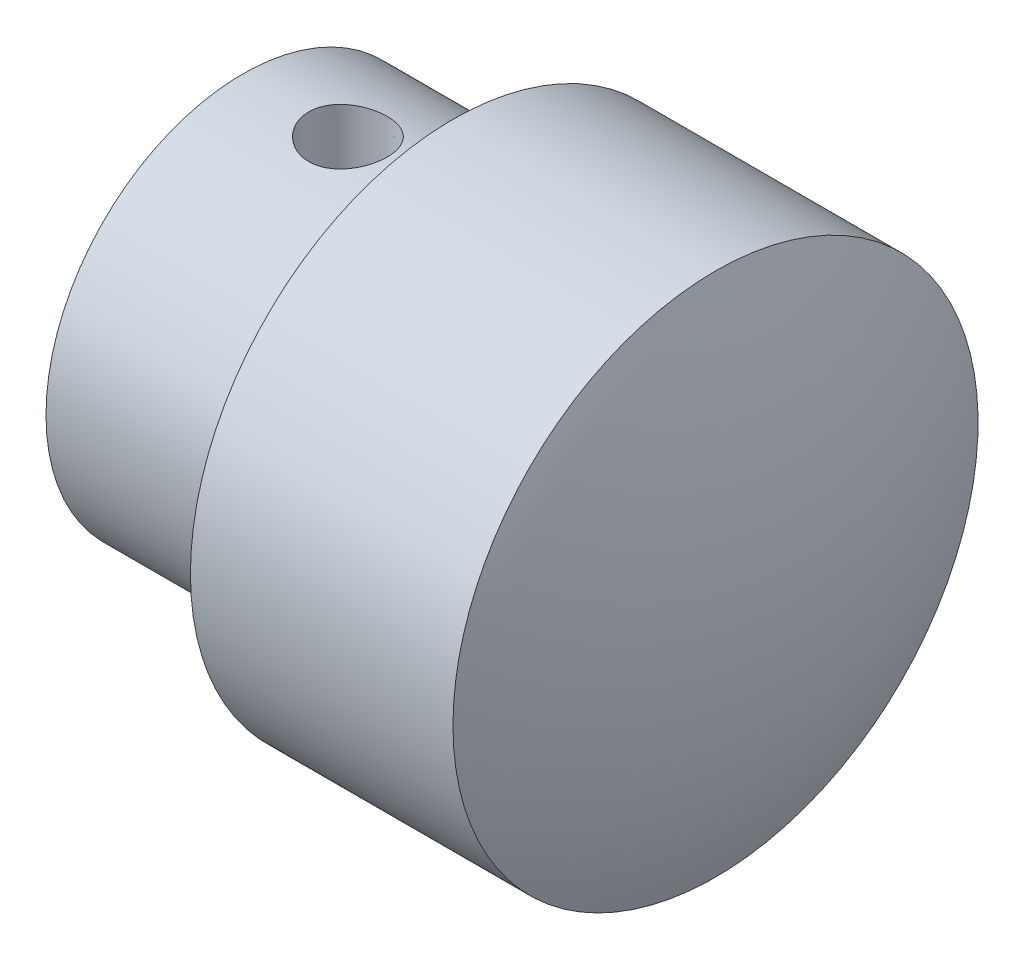
ISO-10303-21;
HEADER;
FILE_DESCRIPTION(('STEP AP214'),'2;1');
FILE_NAME('part.step','',(''),(''),'','','');
FILE_SCHEMA(('AUTOMOTIVE_DESIGN { 1 0 10303 214 1 1 1 1 }'));
ENDSEC;
DATA;
#1=APPLICATION_CONTEXT('core data for automotive mechanical design processes');
#2=APPLICATION_PROTOCOL_DEFINITION('international standard','automotive_design',2000,#1);
#3=PRODUCT_CONTEXT('',#1,'mechanical');
#4=PRODUCT('Part','Part','',(#3));
#5=PRODUCT_RELATED_PRODUCT_CATEGORY('part','',(#4));
#6=PRODUCT_DEFINITION_FORMATION('','',#4);
#7=PRODUCT_DEFINITION_CONTEXT('part definition',#1,'design');
#8=PRODUCT_DEFINITION('design','',#6,#7);
#9=PRODUCT_DEFINITION_SHAPE('','',#8);
#10=(LENGTH_UNIT() NAMED_UNIT(*) SI_UNIT(.MILLI.,.METRE.));
#11=(NAMED_UNIT(*) PLANE_ANGLE_UNIT() SI_UNIT($,.RADIAN.));
#12=(NAMED_UNIT(*) SI_UNIT($,.STERADIAN.) SOLID_ANGLE_UNIT());
#13=UNCERTAINTY_MEASURE_WITH_UNIT(LENGTH_MEASURE(1.E-05),#10,'distance_accuracy_value','');
#14=(GEOMETRIC_REPRESENTATION_CONTEXT(3) GLOBAL_UNCERTAINTY_ASSIGNED_CONTEXT((#13)) GLOBAL_UNIT_ASSIGNED_CONTEXT((#10,
#11,#12)) REPRESENTATION_CONTEXT('',''));
#15=CARTESIAN_POINT('',(0.,0.,0.));
#16=DIRECTION('',(0.,0.,1.));
#17=DIRECTION('',(1.,0.,0.));
#18=AXIS2_PLACEMENT_3D('',#15,#16,#17);
#19=CARTESIAN_POINT('',(0.,0.,0.));
#20=DIRECTION('',(-1.,0.,0.));
#21=DIRECTION('',(0.,0.,1.));
#22=AXIS2_PLACEMENT_3D('',#19,#20,#21);
#23=CYLINDRICAL_SURFACE('',#22,7.5);
#24=CARTESIAN_POINT('',(0.,0.,0.));
#25=DIRECTION('',(-1.,0.,0.));
#26=DIRECTION('',(0.,0.,1.));
#27=AXIS2_PLACEMENT_3D('',#24,#25,#26);
#28=CIRCLE('',#27,7.49999999999999);
#29=CARTESIAN_POINT('',(0.,0.,7.49999999999999));
#30=VERTEX_POINT('',#29);
#31=EDGE_CURVE('E11',#30,#30,#28,.T.);
#32=ORIENTED_EDGE('',*,*,#31,.F.);
#33=EDGE_LOOP('',(#32));
#34=FACE_BOUND('',#33,.T.);
#35=CARTESIAN_POINT('',(8.,0.,0.));
#36=DIRECTION('',(-1.,0.,0.));
#37=DIRECTION('',(0.,0.,1.));
#38=AXIS2_PLACEMENT_3D('',#35,#36,#37);
#39=CIRCLE('',#38,7.5);
#40=CARTESIAN_POINT('',(8.,0.,7.5));
#41=VERTEX_POINT('',#40);
#42=EDGE_CURVE('E59',#41,#41,#39,.T.);
#43=ORIENTED_EDGE('',*,*,#42,.T.);
#44=EDGE_LOOP('',(#43));
#45=FACE_BOUND('',#44,.T.);
#46=CARTESIAN_POINT('',(2.97615065401685,7.42093844691968,-1.08612732542257));
#47=CARTESIAN_POINT('',(2.91522724591919,7.42933419585588,-1.02875917320754));
#48=CARTESIAN_POINT('',(2.85911370874383,7.43780352092569,-0.966236493464316));
#49=CARTESIAN_POINT('',(2.7580842460814,7.45394905366219,-0.832570128404476));
#50=CARTESIAN_POINT('',(2.71317695100907,7.4616246473942,-0.761419860882538));
#51=CARTESIAN_POINT('',(2.63587515097579,7.47532757332012,-0.612428147921648));
#52=CARTESIAN_POINT('',(2.60348496098401,7.481354336911,-0.53458440635436));
#53=CARTESIAN_POINT('',(2.55224637023567,7.49107627205063,-0.37443796083214));
#54=CARTESIAN_POINT('',(2.53339436926293,7.49477206344392,-0.292136448599569));
#55=CARTESIAN_POINT('',(2.50997578782903,7.49938471505593,-0.126508551241872));
#56=CARTESIAN_POINT('',(2.50523211115868,7.50033602112167,-0.0432081665425652));
#57=CARTESIAN_POINT('',(2.5096805906007,7.49945173465987,0.123003414211219));
#58=CARTESIAN_POINT('',(2.51887235131164,7.49761622120503,0.205914621241193));
#59=CARTESIAN_POINT('',(2.55073377020251,7.4913950904734,0.368141519096682));
#60=CARTESIAN_POINT('',(2.57326876218644,7.48703496238873,0.447484727147392));
#61=CARTESIAN_POINT('',(2.6310192630518,7.47625776783849,0.601262464158107));
#62=CARTESIAN_POINT('',(2.6662356201932,7.46984056377769,0.675696664359079));
#63=CARTESIAN_POINT('',(2.74881056768671,7.45555373059613,0.81849407662295));
#64=CARTESIAN_POINT('',(2.79630434051209,7.44766822375624,0.88677748815425));
#65=CARTESIAN_POINT('',(2.90191625503024,7.43134952875286,1.01449333004704));
#66=CARTESIAN_POINT('',(2.96003555570116,7.42291628090934,1.07392479359887));
#67=CARTESIAN_POINT('',(3.08635746819034,7.4062862899119,1.18323096408435));
#68=CARTESIAN_POINT('',(3.15470670886635,7.39809550048994,1.23293730535804));
#69=CARTESIAN_POINT('',(3.29891020726078,7.3830275827894,1.32017851698108));
#70=CARTESIAN_POINT('',(3.37476426966443,7.37615042033701,1.35771370397893));
#71=CARTESIAN_POINT('',(3.53158457609144,7.36453281304644,1.41938150136861));
#72=CARTESIAN_POINT('',(3.61253165577032,7.35978484730975,1.44356135767189));
#73=CARTESIAN_POINT('',(3.77744635859976,7.35295599944563,1.47795482333213));
#74=CARTESIAN_POINT('',(3.86141358926746,7.3508747720412,1.48817024075182));
#75=CARTESIAN_POINT('',(4.02840277288348,7.34964116935119,1.49425009977339));
#76=CARTESIAN_POINT('',(4.11141536177421,7.35043790337176,1.49036389335648));
#77=CARTESIAN_POINT('',(4.27557960729545,7.35475292683973,1.46892025419259));
#78=CARTESIAN_POINT('',(4.35673129129481,7.3582711762346,1.45136302264207));
#79=CARTESIAN_POINT('',(4.514610166327,7.36760425417636,1.40321100089764));
#80=CARTESIAN_POINT('',(4.59135183573448,7.37341100956784,1.37266201204682));
#81=CARTESIAN_POINT('',(4.73865434456207,7.3866678725096,1.29942919143104));
#82=CARTESIAN_POINT('',(4.80921455507332,7.39411814700278,1.25674412679878));
#83=CARTESIAN_POINT('',(4.94337947522732,7.4099726727846,1.15963651080529));
#84=CARTESIAN_POINT('',(5.00685356445429,7.41839037874386,1.10503566084357));
#85=CARTESIAN_POINT('',(5.12381019671236,7.43514699865154,0.985999341140916));
#86=CARTESIAN_POINT('',(5.17729200099745,7.44348590673106,0.921563144896099));
#87=CARTESIAN_POINT('',(5.27328997087178,7.45924969673335,0.783861107239898));
#88=CARTESIAN_POINT('',(5.31568617685491,7.46666415892899,0.710510324868336));
#89=CARTESIAN_POINT('',(5.38751451237156,7.47963952548557,0.557561509248243));
#90=CARTESIAN_POINT('',(5.41694773690012,7.48520058639539,0.47796400433562));
#91=CARTESIAN_POINT('',(5.46166751556251,7.49378528085991,0.315750911835908));
#92=CARTESIAN_POINT('',(5.47711402297072,7.49683756672341,0.233180976893757));
#93=CARTESIAN_POINT('',(5.49394125072759,7.50016714558136,0.0665683518774799));
#94=CARTESIAN_POINT('',(5.49532346480348,7.50044473326829,-0.0174741808466193));
#95=CARTESIAN_POINT('',(5.48407089236997,7.49821239079189,-0.183239764262011));
#96=CARTESIAN_POINT('',(5.47165659716133,7.49574630838335,-0.264978497434312));
#97=CARTESIAN_POINT('',(5.43355572605268,7.48836783291416,-0.425183368633737));
#98=CARTESIAN_POINT('',(5.40786884560192,7.48345538371964,-0.503649431522007));
#99=CARTESIAN_POINT('',(5.34387709118843,7.47169442085938,-0.655442647988567));
#100=CARTESIAN_POINT('',(5.30552506899513,7.46483868668969,-0.72874933871561));
#101=CARTESIAN_POINT('',(5.21732495312889,7.44993723926267,-0.867953226556022));
#102=CARTESIAN_POINT('',(5.16747553960559,7.44189138942333,-0.933849571701131));
#103=CARTESIAN_POINT('',(5.05665481638438,7.42532543295365,-1.05759849096597));
#104=CARTESIAN_POINT('',(4.99550236128998,7.41679945458319,-1.11528815083435));
#105=CARTESIAN_POINT('',(4.86434270632167,7.40035618998209,-1.21964195696541));
#106=CARTESIAN_POINT('',(4.79433513052719,7.39243892961592,-1.26630563490805));
#107=CARTESIAN_POINT('',(4.64696511413129,7.37807239990575,-1.34750292605347));
#108=CARTESIAN_POINT('',(4.56956523451129,7.37163123309209,-1.38197012748431));
#109=CARTESIAN_POINT('',(4.40991927726535,7.36103082172352,-1.43736823368169));
#110=CARTESIAN_POINT('',(4.32767388336374,7.35687125607415,-1.45830104324547));
#111=CARTESIAN_POINT('',(4.16201677828068,7.35137690196529,-1.48574992383013));
#112=CARTESIAN_POINT('',(4.07864225751667,7.34999980009896,-1.49248201821368));
#113=CARTESIAN_POINT('',(3.91192940208632,7.35010677846984,-1.49195538120147));
#114=CARTESIAN_POINT('',(3.82859107074363,7.35159108153114,-1.48469556022351));
#115=CARTESIAN_POINT('',(3.66531755208976,7.35721164448419,-1.4565834976114));
#116=CARTESIAN_POINT('',(3.58535453592143,7.36131772156346,-1.43588591139124));
#117=CARTESIAN_POINT('',(3.4300876957901,7.37168210487176,-1.38168683092028));
#118=CARTESIAN_POINT('',(3.35478083424037,7.37793899009575,-1.34819378880254));
#119=CARTESIAN_POINT('',(3.22719505297857,7.39031313797362,-1.27836598689928));
#120=CARTESIAN_POINT('',(3.17357123116635,7.39613921155687,-1.24440531592062));
#121=CARTESIAN_POINT('',(3.07109718241153,7.40827562078396,-1.16998932371552));
#122=CARTESIAN_POINT('',(3.02224711995708,7.41458597310109,-1.12953377882378));
#123=CARTESIAN_POINT('',(2.97615065401685,7.42093844691968,-1.08612732542257));
#124=B_SPLINE_CURVE_WITH_KNOTS('',3,(#46,#47,#48,#49,#50,#51,#52,#53,#54,#55,#56,#57,#58,#59,
#60,#61,#62,#63,#64,#65,#66,#67,#68,#69,#70,#71,#72,#73,#74,#75,#76,#77,#78,#79,#80,#81,#82,#83,
#84,#85,#86,#87,#88,#89,#90,#91,#92,#93,#94,#95,#96,#97,#98,#99,#100,#101,#102,#103,#104,#105,
#106,#107,#108,#109,#110,#111,#112,#113,#114,#115,#116,#117,#118,#119,#120,#121,#122,#123),
.UNSPECIFIED.,.T.,.F.,(4,2,2,2,2,2,2,2,2,2,2,2,2,2,2,2,2,2,2,2,2,2,2,2,2,2,2,2,2,2,2,2,2,2,2,2,
2,2,4),(0.,0.252081515947381,0.504356575807323,0.756718523979321,1.00901333655779,
1.25812753816831,1.50723467159227,1.7538695512333,2.0005209314142,2.25001324622722,
2.49953279063766,2.75304994086387,3.00656049498048,3.25916838854258,3.511743572291,
3.75987453155652,4.00800183914809,4.25526155314622,4.5025463944922,4.75382181659721,
5.00511580856114,5.25902601201058,5.51291476331455,5.76386194197726,6.014782468,
6.26174980309121,6.50872280530964,6.7566257722431,7.00455721153216,7.25687452444697,
7.50920255241852,7.76288413733752,8.01653001195424,8.26628870770265,8.51606685351331,
8.76302007225518,9.00981044549054,9.20053626241585,9.39126864881489),.UNSPECIFIED.);
#125=CARTESIAN_POINT('',(2.97615065401685,7.42093844691968,-1.08612732542257));
#126=VERTEX_POINT('',#125);
#127=EDGE_CURVE('E108',#126,#126,#124,.T.);
#128=ORIENTED_EDGE('',*,*,#127,.F.);
#129=EDGE_LOOP('',(#128));
#130=FACE_BOUND('',#129,.T.);
#131=CARTESIAN_POINT('',(3.03665773118595,-7.4293107576259,-1.02729823645528));
#132=CARTESIAN_POINT('',(3.09410278698516,-7.42185457442499,-1.08122153369808));
#133=CARTESIAN_POINT('',(3.15611413118544,-7.41446288827785,-1.13034511803816));
#134=CARTESIAN_POINT('',(3.28759199724185,-7.40063679882848,-1.21759468075537));
#135=CARTESIAN_POINT('',(3.35706423407999,-7.39420313849887,-1.25571214490594));
#136=CARTESIAN_POINT('',(3.5015636904899,-7.38303094592566,-1.31981747397934));
#137=CARTESIAN_POINT('',(3.57659278703572,-7.37829298963103,-1.34580121857376));
#138=CARTESIAN_POINT('',(3.73003729575592,-7.37107267072744,-1.38480542124693));
#139=CARTESIAN_POINT('',(3.80845182302608,-7.36858972238553,-1.39782924571823));
#140=CARTESIAN_POINT('',(3.96544185899129,-7.3661882554668,-1.41042963417831));
#141=CARTESIAN_POINT('',(4.04400408963656,-7.36623925442609,-1.41016604041192));
#142=CARTESIAN_POINT('',(4.19995150518375,-7.36882377129706,-1.39659680128372));
#143=CARTESIAN_POINT('',(4.27733668946113,-7.37135729052588,-1.38329114900225));
#144=CARTESIAN_POINT('',(4.42827401913363,-7.37858950483184,-1.34417463528646));
#145=CARTESIAN_POINT('',(4.50184618143085,-7.38327526513212,-1.318438433359));
#146=CARTESIAN_POINT('',(4.6436468019706,-7.39427802885979,-1.25525903299782));
#147=CARTESIAN_POINT('',(4.71187482234242,-7.40059516577172,-1.2178148765284));
#148=CARTESIAN_POINT('',(4.84205612858868,-7.41425618778502,-1.13169135734835));
#149=CARTESIAN_POINT('',(4.90391208535388,-7.42161280226302,-1.0828669097833));
#150=CARTESIAN_POINT('',(5.01862850046725,-7.43647136584286,-0.975611862252668));
#151=CARTESIAN_POINT('',(5.07148822447486,-7.44397332675336,-0.917180478860985));
#152=CARTESIAN_POINT('',(5.16736409070226,-7.45838816438591,-0.791509780578306));
#153=CARTESIAN_POINT('',(5.21025162708516,-7.46529269283949,-0.724171277491351));
#154=CARTESIAN_POINT('',(5.28409767955282,-7.47763186538167,-0.583118150966646));
#155=CARTESIAN_POINT('',(5.31505681113753,-7.48306658530736,-0.509403856757048));
#156=CARTESIAN_POINT('',(5.36393002978088,-7.4918193358684,-0.35823201345033));
#157=CARTESIAN_POINT('',(5.3819358411742,-7.49515222865436,-0.280805010399186));
#158=CARTESIAN_POINT('',(5.4046921275896,-7.49938549662434,-0.123964561431673));
#159=CARTESIAN_POINT('',(5.40944393056179,-7.5002861155033,-0.0445513153261188));
#160=CARTESIAN_POINT('',(5.40557130745179,-7.49955876984867,0.112776464756872));
#161=CARTESIAN_POINT('',(5.39714023978844,-7.49796735644071,0.190696008919006));
#162=CARTESIAN_POINT('',(5.36752574567137,-7.49250008233031,0.343987044477736));
#163=CARTESIAN_POINT('',(5.34634223952669,-7.48862420735211,0.419358519948146));
#164=CARTESIAN_POINT('',(5.29184456233883,-7.47900872297953,0.565509224018031));
#165=CARTESIAN_POINT('',(5.2585216409348,-7.47326776951889,0.636285096535123));
#166=CARTESIAN_POINT('',(5.18070571903896,-7.4605446920175,0.771282083495594));
#167=CARTESIAN_POINT('',(5.13621164142587,-7.45356244831068,0.835502565028763));
#168=CARTESIAN_POINT('',(5.0365331690706,-7.43900029725952,0.95658444530349));
#169=CARTESIAN_POINT('',(4.98119980731926,-7.43141305319623,1.01332237216176));
#170=CARTESIAN_POINT('',(4.86178558322886,-7.41657587242605,1.1167538865832));
#171=CARTESIAN_POINT('',(4.79770429608449,-7.40932595212277,1.1634469860788));
#172=CARTESIAN_POINT('',(4.66210768788335,-7.39593880358289,1.24573039712251));
#173=CARTESIAN_POINT('',(4.59054874960706,-7.38980875082114,1.28125009498715));
#174=CARTESIAN_POINT('',(4.44233958312178,-7.37943360134041,1.33971925868494));
#175=CARTESIAN_POINT('',(4.36568986105652,-7.37518831755258,1.36266997207948));
#176=CARTESIAN_POINT('',(4.21053792931432,-7.36912927995165,1.39506434331679));
#177=CARTESIAN_POINT('',(4.13207288998426,-7.36728455275436,1.40468016444476));
#178=CARTESIAN_POINT('',(3.97462465681021,-7.36614342924877,1.41065283873098));
#179=CARTESIAN_POINT('',(3.89564150602957,-7.36684682376388,1.40701078023501));
#180=CARTESIAN_POINT('',(3.74044401659856,-7.37069300308505,1.3867179031011));
#181=CARTESIAN_POINT('',(3.66420734950487,-7.37380500043243,1.37023125032837));
#182=CARTESIAN_POINT('',(3.51559713771747,-7.382073643746,1.32495806546479));
#183=CARTESIAN_POINT('',(3.44322378209217,-7.3872303896772,1.2961709320146));
#184=CARTESIAN_POINT('',(3.30378131774022,-7.39905387323967,1.22688231285854));
#185=CARTESIAN_POINT('',(3.23675576983028,-7.40573158022079,1.18629510476249));
#186=CARTESIAN_POINT('',(3.110394370036,-7.41983334905802,1.09463113907195));
#187=CARTESIAN_POINT('',(3.05105931742245,-7.42725748834843,1.04355329261222));
#188=CARTESIAN_POINT('',(2.94077495852432,-7.44216058814467,0.93139142578955));
#189=CARTESIAN_POINT('',(2.8899744657854,-7.44963853493295,0.870160829071705));
#190=CARTESIAN_POINT('',(2.79934610446581,-7.46369473067213,0.739960567178312));
#191=CARTESIAN_POINT('',(2.75951827842098,-7.47027297613528,0.670990872003404));
#192=CARTESIAN_POINT('',(2.69198026547789,-7.48179604291324,0.527187764805746));
#193=CARTESIAN_POINT('',(2.66427475629963,-7.48674023350459,0.452352102353912));
#194=CARTESIAN_POINT('',(2.62186047136168,-7.49443130983173,0.298979510065364));
#195=CARTESIAN_POINT('',(2.60715000047643,-7.49717848215108,0.220443064382073));
#196=CARTESIAN_POINT('',(2.59131043168969,-7.50014057932542,0.0631452651023355));
#197=CARTESIAN_POINT('',(2.58998311541787,-7.50039246103334,-0.0155954725394543));
#198=CARTESIAN_POINT('',(2.60043744054345,-7.49843215527774,-0.172181334306137));
#199=CARTESIAN_POINT('',(2.61222063269795,-7.49621967632093,-0.250026351381552));
#200=CARTESIAN_POINT('',(2.64841023730694,-7.48959797004691,-0.402100643928314));
#201=CARTESIAN_POINT('',(2.67273744701218,-7.48520253224143,-0.476349445361678));
#202=CARTESIAN_POINT('',(2.73323667065146,-7.47470151429793,-0.619675611114843));
#203=CARTESIAN_POINT('',(2.76940042367254,-7.46859712729152,-0.688756540982571));
#204=CARTESIAN_POINT('',(2.84265804770104,-7.45691209620988,-0.8043647345569));
#205=CARTESIAN_POINT('',(2.87750183645717,-7.45154998765328,-0.852357933415062));
#206=CARTESIAN_POINT('',(2.95292385634875,-7.44055004359068,-0.943569866240525));
#207=CARTESIAN_POINT('',(2.9935022475301,-7.43491220039213,-0.986788466894509));
#208=CARTESIAN_POINT('',(3.03665773118595,-7.4293107576259,-1.02729823645528));
#209=B_SPLINE_CURVE_WITH_KNOTS('',3,(#131,#132,#133,#134,#135,#136,#137,#138,#139,#140,#141,
#142,#143,#144,#145,#146,#147,#148,#149,#150,#151,#152,#153,#154,#155,#156,#157,#158,#159,#160,
#161,#162,#163,#164,#165,#166,#167,#168,#169,#170,#171,#172,#173,#174,#175,#176,#177,#178,#179,
#180,#181,#182,#183,#184,#185,#186,#187,#188,#189,#190,#191,#192,#193,#194,#195,#196,#197,#198,
#199,#200,#201,#202,#203,#204,#205,#206,#207,#208),.UNSPECIFIED.,.T.,.F.,(4,2,2,2,2,2,2,2,2,2,2,
2,2,2,2,2,2,2,2,2,2,2,2,2,2,2,2,2,2,2,2,2,2,2,2,2,2,2,4),(0.,0.237210847614707,
0.474604710566047,0.712079128425355,0.949491845213397,1.18404927295921,1.41860682515306,
1.651772789335,1.88495783796086,2.1212962167612,2.35765387804418,2.5969088239541,
2.83615142277012,3.07368277304371,3.31119032364078,3.54524679954224,3.77930473809582,
4.01353172573852,4.24778130619293,4.48551018663708,4.72325061546955,4.96246465877246,
5.20165495406969,5.4377274335164,5.67378053409555,5.90686518070686,6.13996122391907,
6.37479482870681,6.60965282014102,6.8482560174967,7.08686013979097,7.32555625283778,
7.56422122479484,7.79934603507389,8.03449865970036,8.26818439146603,8.50170737675169,
8.67990657884771,8.85811075525255),.UNSPECIFIED.);
#210=CARTESIAN_POINT('',(3.03665773118595,-7.4293107576259,-1.02729823645528));
#211=VERTEX_POINT('',#210);
#212=EDGE_CURVE('E83',#211,#211,#209,.T.);
#213=ORIENTED_EDGE('',*,*,#212,.F.);
#214=EDGE_LOOP('',(#213));
#215=FACE_BOUND('',#214,.T.);
#216=ADVANCED_FACE('F45',(#34,#45,#130,#215),#23,.T.);
#217=CARTESIAN_POINT('',(0.,0.,0.));
#218=DIRECTION('',(-1.,0.,0.));
#219=DIRECTION('',(0.,0.,1.));
#220=AXIS2_PLACEMENT_3D('',#217,#218,#219);
#221=CYLINDRICAL_SURFACE('',#220,4.);
#222=CARTESIAN_POINT('',(8.,0.,0.));
#223=DIRECTION('',(-1.,0.,0.));
#224=DIRECTION('',(0.,0.,1.));
#225=AXIS2_PLACEMENT_3D('',#222,#223,#224);
#226=CIRCLE('',#225,4.);
#227=CARTESIAN_POINT('',(8.,0.,4.));
#228=VERTEX_POINT('',#227);
#229=EDGE_CURVE('E71',#228,#228,#226,.T.);
#230=ORIENTED_EDGE('',*,*,#229,.F.);
#231=EDGE_LOOP('',(#230));
#232=FACE_BOUND('',#231,.T.);
#233=CARTESIAN_POINT('',(0.,0.,0.));
#234=DIRECTION('',(-1.,0.,0.));
#235=DIRECTION('',(0.,0.,1.));
#236=AXIS2_PLACEMENT_3D('',#233,#234,#235);
#237=CIRCLE('',#236,4.);
#238=CARTESIAN_POINT('',(0.,0.,4.));
#239=VERTEX_POINT('',#238);
#240=EDGE_CURVE('E75',#239,#239,#237,.T.);
#241=ORIENTED_EDGE('',*,*,#240,.T.);
#242=EDGE_LOOP('',(#241));
#243=FACE_BOUND('',#242,.T.);
#244=CARTESIAN_POINT('',(3.01607530710737,3.84711894267817,-1.09529714730262));
#245=CARTESIAN_POINT('',(3.07657318321638,3.83168027863818,-1.14952069833984));
#246=CARTESIAN_POINT('',(3.14168826839649,3.81639678207783,-1.19883785023725));
#247=CARTESIAN_POINT('',(3.27961568386653,3.78782284370173,-1.28628668962361));
#248=CARTESIAN_POINT('',(3.35244692162714,3.77453750007175,-1.32438999459043));
#249=CARTESIAN_POINT('',(3.5040824733147,3.75155123115189,-1.38817123595585));
#250=CARTESIAN_POINT('',(3.58289647217668,3.74185627381794,-1.41382850623585));
#251=CARTESIAN_POINT('',(3.74407808526805,3.72737060756455,-1.45159463835866));
#252=CARTESIAN_POINT('',(3.8264418549769,3.72257472529996,-1.46371779327089));
#253=CARTESIAN_POINT('',(3.98831086002611,3.71863655620777,-1.47369176899786));
#254=CARTESIAN_POINT('',(4.06777108120934,3.71924191536354,-1.47217961530008));
#255=CARTESIAN_POINT('',(4.22523093514973,3.72542449410387,-1.45646205812643));
#256=CARTESIAN_POINT('',(4.30323040933735,3.73100225030308,-1.44225528466324));
#257=CARTESIAN_POINT('',(4.45401459062568,3.74626572718547,-1.40211882775816));
#258=CARTESIAN_POINT('',(4.52687239529704,3.75586705330281,-1.37642929706975));
#259=CARTESIAN_POINT('',(4.66731729167138,3.77807699894341,-1.31423735203065));
#260=CARTESIAN_POINT('',(4.73490310248667,3.79068634629657,-1.27773232021063));
#261=CARTESIAN_POINT('',(4.86688679559113,3.81834988352507,-1.19260627327283));
#262=CARTESIAN_POINT('',(4.93090692614333,3.83350019345915,-1.1434308591399));
#263=CARTESIAN_POINT('',(5.05005551300351,3.86409458512989,-1.03533820215852));
#264=CARTESIAN_POINT('',(5.10518109243736,3.87953876011649,-0.976417819803579));
#265=CARTESIAN_POINT('',(5.20748897733994,3.90982081272645,-0.847283202503959));
#266=CARTESIAN_POINT('',(5.25419719958165,3.92459935698055,-0.776677746305177));
#267=CARTESIAN_POINT('',(5.33499781502889,3.95110555776736,-0.628054292670777));
#268=CARTESIAN_POINT('',(5.36909310385526,3.96283391436466,-0.550038001756736));
#269=CARTESIAN_POINT('',(5.42261965576138,3.98160801858713,-0.391157120071311));
#270=CARTESIAN_POINT('',(5.44245140906305,3.98878093101454,-0.31044302205245));
#271=CARTESIAN_POINT('',(5.46823169201285,3.99815543457554,-0.146555337971825));
#272=CARTESIAN_POINT('',(5.47418571589311,4.00035899307913,-0.0633827384491657));
#273=CARTESIAN_POINT('',(5.47202683723066,3.99956661839109,0.0981681567176807));
#274=CARTESIAN_POINT('',(5.46466780029151,3.9968493245576,0.176559126293508));
#275=CARTESIAN_POINT('',(5.43762657822037,3.98704013975464,0.330894341664621));
#276=CARTESIAN_POINT('',(5.41794433360477,3.97994822766907,0.406838575647758));
#277=CARTESIAN_POINT('',(5.36698591935491,3.96211787019397,0.554195290123258));
#278=CARTESIAN_POINT('',(5.335717757773,3.95138194393441,0.625610860939301));
#279=CARTESIAN_POINT('',(5.26255617389674,3.92730606417365,0.762292332680423));
#280=CARTESIAN_POINT('',(5.22065994135429,3.91396542215521,0.827556600823477));
#281=CARTESIAN_POINT('',(5.12483201524067,3.88518098308428,0.953826844235501));
#282=CARTESIAN_POINT('',(5.07037661526121,3.86966287595089,1.01441860475708));
#283=CARTESIAN_POINT('',(4.95221253378178,3.83872600625522,1.12584793132636));
#284=CARTESIAN_POINT('',(4.88850077871094,3.82330727847484,1.17668224435031));
#285=CARTESIAN_POINT('',(4.75082595343059,3.79370226839213,1.26896060207596));
#286=CARTESIAN_POINT('',(4.67657557493864,3.77958068154702,1.30999879604773));
#287=CARTESIAN_POINT('',(4.52162789746121,3.75499921916751,1.37888679469091));
#288=CARTESIAN_POINT('',(4.44093312792986,3.74453791554635,1.4067417444026));
#289=CARTESIAN_POINT('',(4.27872512685304,3.72902475798177,1.4473537905535));
#290=CARTESIAN_POINT('',(4.19736948178372,3.72377596560581,1.46066263045645));
#291=CARTESIAN_POINT('',(4.03342329637402,3.71870655354613,1.47352447132725));
#292=CARTESIAN_POINT('',(3.95083323990851,3.71888385992411,1.47308272797815));
#293=CARTESIAN_POINT('',(3.79170459683405,3.72447014224496,1.45889311281526));
#294=CARTESIAN_POINT('',(3.71508695459238,3.7295842442506,1.4458951885815));
#295=CARTESIAN_POINT('',(3.56520678546131,3.74398377932187,1.4081862768259));
#296=CARTESIAN_POINT('',(3.49194475620544,3.7532698288896,1.38347355814149));
#297=CARTESIAN_POINT('',(3.34922036740743,3.77516323170172,1.32257444406269));
#298=CARTESIAN_POINT('',(3.27985717387553,3.78783057375804,1.2861781314302));
#299=CARTESIAN_POINT('',(3.14800062123583,3.81503410369289,1.20308856660005));
#300=CARTESIAN_POINT('',(3.08550957218343,3.82957091644895,1.15639186771027));
#301=CARTESIAN_POINT('',(2.96499216645303,3.86000328361614,1.05051986472117));
#302=CARTESIAN_POINT('',(2.90750291635569,3.87592643821414,0.990739608388427));
#303=CARTESIAN_POINT('',(2.8032244996038,3.90653361390775,0.862181203689362));
#304=CARTESIAN_POINT('',(2.75643672461025,3.92121747368421,0.793401886876793));
#305=CARTESIAN_POINT('',(2.67441929614468,3.9479322120754,0.647599109162615));
#306=CARTESIAN_POINT('',(2.63934111959809,3.95992770767125,0.570483502292606));
#307=CARTESIAN_POINT('',(2.58284576885604,3.97965076323979,0.410889880820614));
#308=CARTESIAN_POINT('',(2.56142289631438,3.98738010329458,0.328414118860533));
#309=CARTESIAN_POINT('',(2.53387131195381,3.99738440041879,0.16509878100937));
#310=CARTESIAN_POINT('',(2.52699830840448,3.99992454921727,0.0844008419827819));
#311=CARTESIAN_POINT('',(2.52659609171923,4.00007204031515,-0.0770136286197528));
#312=CARTESIAN_POINT('',(2.53306240447798,3.99768103655964,-0.15773014488522));
#313=CARTESIAN_POINT('',(2.55857965492841,3.98841000169931,-0.313818052515679));
#314=CARTESIAN_POINT('',(2.57716227591601,3.9816971352168,-0.389276991079616));
#315=CARTESIAN_POINT('',(2.62580233073778,3.96461285295825,-0.536010844837613));
#316=CARTESIAN_POINT('',(2.65586836287797,3.95423869620187,-0.607282578574005));
#317=CARTESIAN_POINT('',(2.72762025507641,3.93046971332037,-0.746001683110514));
#318=CARTESIAN_POINT('',(2.76963626124116,3.91699150242594,-0.813262998036779));
#319=CARTESIAN_POINT('',(2.86364350738166,3.88855192367202,-0.939874717885926));
#320=CARTESIAN_POINT('',(2.91561208737594,3.8735939616047,-0.999242584091));
#321=CARTESIAN_POINT('',(2.98633025990941,3.85479182054627,-1.06807988034422));
#322=CARTESIAN_POINT('',(3.00106058204809,3.85095060274216,-1.0818396218005));
#323=CARTESIAN_POINT('',(3.01607530710737,3.84711894267817,-1.09529714730262));
#324=B_SPLINE_CURVE_WITH_KNOTS('',3,(#244,#245,#246,#247,#248,#249,#250,#251,#252,#253,#254,
#255,#256,#257,#258,#259,#260,#261,#262,#263,#264,#265,#266,#267,#268,#269,#270,#271,#272,#273,
#274,#275,#276,#277,#278,#279,#280,#281,#282,#283,#284,#285,#286,#287,#288,#289,#290,#291,#292,
#293,#294,#295,#296,#297,#298,#299,#300,#301,#302,#303,#304,#305,#306,#307,#308,#309,#310,#311,
#312,#313,#314,#315,#316,#317,#318,#319,#320,#321,#322,#323),.UNSPECIFIED.,.T.,.F.,(4,2,2,2,2,2,
2,2,2,2,2,2,2,2,2,2,2,2,2,2,2,2,2,2,2,2,2,2,2,2,2,2,2,2,2,2,2,2,2,4),(0.,0.248035366416622,
0.496693221408064,0.745762560925499,0.994568614452028,1.23181322603015,1.46908344383945,
1.70160802864509,1.934188932969,2.17951725426689,2.42492476674475,2.68147067098699,
2.93795764196367,3.1869274238224,3.43579862108904,3.67101538325078,3.90623328080257,
4.14128890080862,4.37640673854032,4.62409487531809,4.87186544566461,5.12859218455111,
5.38521864760196,5.63173146316649,5.87815005892318,6.11070612987372,6.34329657769102,
6.58032476429035,6.81743238537342,7.06962727683607,7.32185494606994,7.57722931370008,
7.83249704394653,8.07435548671017,8.31613282155348,8.54907855914393,8.78219905994724,
9.0225182267556,9.26229660452339,9.32385550660801),.UNSPECIFIED.);
#325=CARTESIAN_POINT('',(3.01607530710737,3.84711894267817,-1.09529714730262));
#326=VERTEX_POINT('',#325);
#327=EDGE_CURVE('E92',#326,#326,#324,.T.);
#328=ORIENTED_EDGE('',*,*,#327,.F.);
#329=EDGE_LOOP('',(#328));
#330=FACE_BOUND('',#329,.T.);
#331=CARTESIAN_POINT('',(3.04885733118646,-3.85535231120161,-1.06595429382001));
#332=CARTESIAN_POINT('',(2.98913325376912,-3.87011711152505,-1.0125504943336));
#333=CARTESIAN_POINT('',(2.9339342296409,-3.88506867524569,-0.95414135458281));
#334=CARTESIAN_POINT('',(2.83397029894179,-3.91373792510702,-0.828725890202523));
#335=CARTESIAN_POINT('',(2.78920367481829,-3.92745581412674,-0.761720983569407));
#336=CARTESIAN_POINT('',(2.71131000987805,-3.95221351060906,-0.620600009565497));
#337=CARTESIAN_POINT('',(2.67820662087873,-3.96324786227151,-0.546469875830123));
#338=CARTESIAN_POINT('',(2.62492955630439,-3.98136902570301,-0.393244182955679));
#339=CARTESIAN_POINT('',(2.60475165481639,-3.98845712757619,-0.314150255995327));
#340=CARTESIAN_POINT('',(2.57862896428548,-3.99769051453536,-0.156439783043773));
#341=CARTESIAN_POINT('',(2.572175990923,-4.00001216480661,-0.0779177737673058));
#342=CARTESIAN_POINT('',(2.57224354688082,-3.99998774606221,0.0791124395636494));
#343=CARTESIAN_POINT('',(2.57876189833032,-3.9976424606198,0.157620643722659));
#344=CARTESIAN_POINT('',(2.60407280978046,-3.98869811366521,0.309680414673109));
#345=CARTESIAN_POINT('',(2.62245207360446,-3.98224237942871,0.383310034085226));
#346=CARTESIAN_POINT('',(2.67043642023835,-3.96586613404105,0.526399293052715));
#347=CARTESIAN_POINT('',(2.70004293968051,-3.9559451794954,0.595858397633656));
#348=CARTESIAN_POINT('',(2.77057252727317,-3.93327861513285,0.730848742873538));
#349=CARTESIAN_POINT('',(2.81179445421004,-3.92046047060146,0.796211305716399));
#350=CARTESIAN_POINT('',(2.90404092970701,-3.89343943592456,0.919296856753852));
#351=CARTESIAN_POINT('',(2.95506885756847,-3.87923606924325,0.977017199704479));
#352=CARTESIAN_POINT('',(3.06860085076131,-3.85010770603585,1.08629403788929));
#353=CARTESIAN_POINT('',(3.13156220839328,-3.83518340969815,1.13737686133348));
#354=CARTESIAN_POINT('',(3.26548737396163,-3.80703513961231,1.22831450592106));
#355=CARTESIAN_POINT('',(3.33645146024698,-3.79381122504069,1.26816893635244));
#356=CARTESIAN_POINT('',(3.48454277489231,-3.77068392486119,1.33536963970615));
#357=CARTESIAN_POINT('',(3.56166558286844,-3.76077818371603,1.3627247907824));
#358=CARTESIAN_POINT('',(3.71987049991359,-3.74560822228251,1.40389103236681));
#359=CARTESIAN_POINT('',(3.80095040373248,-3.74034144722509,1.41770957821829));
#360=CARTESIAN_POINT('',(3.95954487468066,-3.73535180530132,1.43080071203972));
#361=CARTESIAN_POINT('',(4.03698258876537,-3.73531615462813,1.43089397478076));
#362=CARTESIAN_POINT('',(4.1907036746687,-3.74000854706835,1.41858327628545));
#363=CARTESIAN_POINT('',(4.26698712993213,-3.74473624413894,1.40618022286872));
#364=CARTESIAN_POINT('',(4.41435978701212,-3.75818084119677,1.36983054932132));
#365=CARTESIAN_POINT('',(4.48553042090162,-3.76679727786962,1.34617387495434));
#366=CARTESIAN_POINT('',(4.62294717984571,-3.78700360934454,1.28823159062577));
#367=CARTESIAN_POINT('',(4.68919211097781,-3.79859422203526,1.25394341407946));
#368=CARTESIAN_POINT('',(4.81845694633982,-3.82416239998145,1.173727312212));
#369=CARTESIAN_POINT('',(4.8811518745495,-3.8382301002781,1.12730469680817));
#370=CARTESIAN_POINT('',(4.99812942523668,-3.86681960831143,1.02495202255966));
#371=CARTESIAN_POINT('',(5.05240934535373,-3.88134156013272,0.969018921598588));
#372=CARTESIAN_POINT('',(5.15364402499934,-3.91003567287391,0.846042731673736));
#373=CARTESIAN_POINT('',(5.20012542118477,-3.92415804457108,0.778596752319382));
#374=CARTESIAN_POINT('',(5.28106447811596,-3.94971471145017,0.636368909991582));
#375=CARTESIAN_POINT('',(5.31552414251176,-3.96114945447274,0.561588272142658));
#376=CARTESIAN_POINT('',(5.37060160242388,-3.97982127213422,0.408456587841809));
#377=CARTESIAN_POINT('',(5.39150598703402,-3.98714478530804,0.330219587425757));
#378=CARTESIAN_POINT('',(5.41982273302746,-3.99713465998422,0.171060521739682));
#379=CARTESIAN_POINT('',(5.42724024237069,-3.99980279843417,0.0901394929817585));
#380=CARTESIAN_POINT('',(5.42825449645053,-4.0001664287543,-0.0675704964279165));
#381=CARTESIAN_POINT('',(5.42255033977968,-3.9981134547855,-0.144355357864486));
#382=CARTESIAN_POINT('',(5.39897535936724,-3.98976944330912,-0.295788717074829));
#383=CARTESIAN_POINT('',(5.38110470775707,-3.98347846576077,-0.370437245057853));
#384=CARTESIAN_POINT('',(5.33395100275146,-3.96734487124188,-0.515231043907039));
#385=CARTESIAN_POINT('',(5.3047201464163,-3.95751851349884,-0.585395226359425));
#386=CARTESIAN_POINT('',(5.23575372082054,-3.93527503143163,-0.719905528472343));
#387=CARTESIAN_POINT('',(5.19601560424539,-3.92285727901999,-0.78425023221134));
#388=CARTESIAN_POINT('',(5.10492340653352,-3.89597255789567,-0.908649436595723));
#389=CARTESIAN_POINT('',(5.05309984648556,-3.88143545773503,-0.968345079004012));
#390=CARTESIAN_POINT('',(4.94033443719485,-3.85230903954545,-1.07840748421119));
#391=CARTESIAN_POINT('',(4.87938968898089,-3.83771970635953,-1.12877126965143));
#392=CARTESIAN_POINT('',(4.74749808329676,-3.80956596679394,-1.22048924167373));
#393=CARTESIAN_POINT('',(4.67627491018086,-3.79605562642859,-1.26146442720978));
#394=CARTESIAN_POINT('',(4.52739952807023,-3.77233196671157,-1.33073719292366));
#395=CARTESIAN_POINT('',(4.44974951372522,-3.76211752765838,-1.35903907981315));
#396=CARTESIAN_POINT('',(4.29314243891423,-3.74665092189493,-1.40110524019293));
#397=CARTESIAN_POINT('',(4.21433296718857,-3.74123341217762,-1.41535600846941));
#398=CARTESIAN_POINT('',(4.05527275499247,-3.73548852644088,-1.43045302379373));
#399=CARTESIAN_POINT('',(3.97502265235748,-3.73515895081145,-1.43130506336798));
#400=CARTESIAN_POINT('',(3.82013343452123,-3.73950220446633,-1.41991249159521));
#401=CARTESIAN_POINT('',(3.74543132345261,-3.74389658885081,-1.40839690249716));
#402=CARTESIAN_POINT('',(3.5990955454555,-3.7567103168449,-1.37384968164038));
#403=CARTESIAN_POINT('',(3.52746284114414,-3.76513091321962,-1.35081446542074));
#404=CARTESIAN_POINT('',(3.38307266741064,-3.78589499713706,-1.29153557502004));
#405=CARTESIAN_POINT('',(3.31075309451048,-3.79851463780937,-1.25432236752414));
#406=CARTESIAN_POINT('',(3.17371022519493,-3.82580993131283,-1.16841882013422));
#407=CARTESIAN_POINT('',(3.10899017497595,-3.84048645692934,-1.11972360213167));
#408=CARTESIAN_POINT('',(3.04885733118646,-3.85535231120161,-1.06595429382001));
#409=B_SPLINE_CURVE_WITH_KNOTS('',3,(#331,#332,#333,#334,#335,#336,#337,#338,#339,#340,#341,
#342,#343,#344,#345,#346,#347,#348,#349,#350,#351,#352,#353,#354,#355,#356,#357,#358,#359,#360,
#361,#362,#363,#364,#365,#366,#367,#368,#369,#370,#371,#372,#373,#374,#375,#376,#377,#378,#379,
#380,#381,#382,#383,#384,#385,#386,#387,#388,#389,#390,#391,#392,#393,#394,#395,#396,#397,#398,
#399,#400,#401,#402,#403,#404,#405,#406,#407,#408),.UNSPECIFIED.,.T.,.F.,(4,2,2,2,2,2,2,2,2,2,2,
2,2,2,2,2,2,2,2,2,2,2,2,2,2,2,2,2,2,2,2,2,2,2,2,2,2,2,4),(0.,0.244120668485474,0.48820111738814,
0.732773724871582,0.977266329896255,1.21253628138788,1.44776673465275,1.67521331300007,
1.9026890050883,2.13665685181926,2.37070547259293,2.61686830729919,2.86303970662397,
3.109035979208,3.35489669199072,3.58605031627582,3.81718714915927,4.04266715113687,
4.26820162939604,4.50496955220592,4.74181335287241,4.98996313732237,5.23807154311432,
5.4807467899568,5.72332938784302,5.95328884590909,6.18324505057909,6.41215692799133,
6.64112435233351,6.88118426895904,7.12132064607349,7.36989950167027,7.61839381957545,
7.85794592128153,8.09739445718871,8.32346551968383,8.54960697053024,8.79529389305664,
9.04108538383591),.UNSPECIFIED.);
#410=CARTESIAN_POINT('',(3.04885733118646,-3.85535231120161,-1.06595429382001));
#411=VERTEX_POINT('',#410);
#412=EDGE_CURVE('E49',#411,#411,#409,.T.);
#413=ORIENTED_EDGE('',*,*,#412,.F.);
#414=EDGE_LOOP('',(#413));
#415=FACE_BOUND('',#414,.T.);
#416=ADVANCED_FACE('F98',(#232,#243,#330,#415),#221,.F.);
#417=CARTESIAN_POINT('',(0.,0.,0.));
#418=DIRECTION('',(1.,0.,0.));
#419=DIRECTION('',(0.,0.,-1.));
#420=AXIS2_PLACEMENT_3D('',#417,#418,#419);
#421=PLANE('',#420);
#422=ORIENTED_EDGE('',*,*,#240,.F.);
#423=EDGE_LOOP('',(#422));
#424=FACE_BOUND('',#423,.T.);
#425=ORIENTED_EDGE('',*,*,#31,.T.);
#426=EDGE_LOOP('',(#425));
#427=FACE_BOUND('',#426,.T.);
#428=ADVANCED_FACE('F47',(#424,#427),#421,.F.);
#429=CARTESIAN_POINT('',(8.,7.5,0.));
#430=DIRECTION('',(1.,0.,0.));
#431=DIRECTION('',(0.,0.,-1.));
#432=AXIS2_PLACEMENT_3D('',#429,#430,#431);
#433=PLANE('',#432);
#434=ORIENTED_EDGE('',*,*,#42,.F.);
#435=EDGE_LOOP('',(#434));
#436=FACE_BOUND('',#435,.T.);
#437=CARTESIAN_POINT('',(8.,0.,0.));
#438=DIRECTION('',(-1.,0.,0.));
#439=DIRECTION('',(0.,0.,1.));
#440=AXIS2_PLACEMENT_3D('',#437,#438,#439);
#441=CIRCLE('',#440,10.);
#442=CARTESIAN_POINT('',(8.,0.,10.));
#443=VERTEX_POINT('',#442);
#444=EDGE_CURVE('E80',#443,#443,#441,.T.);
#445=ORIENTED_EDGE('',*,*,#444,.T.);
#446=EDGE_LOOP('',(#445));
#447=FACE_BOUND('',#446,.T.);
#448=ADVANCED_FACE('F121',(#436,#447),#433,.F.);
#449=CARTESIAN_POINT('',(0.,0.,0.));
#450=DIRECTION('',(-1.,0.,0.));
#451=DIRECTION('',(0.,0.,1.));
#452=AXIS2_PLACEMENT_3D('',#449,#450,#451);
#453=CYLINDRICAL_SURFACE('',#452,10.);
#454=ORIENTED_EDGE('',*,*,#444,.F.);
#455=EDGE_LOOP('',(#454));
#456=FACE_BOUND('',#455,.T.);
#457=CARTESIAN_POINT('',(18.,0.,0.));
#458=DIRECTION('',(-1.,0.,0.));
#459=DIRECTION('',(0.,0.,1.));
#460=AXIS2_PLACEMENT_3D('',#457,#458,#459);
#461=CIRCLE('',#460,10.);
#462=CARTESIAN_POINT('',(18.,0.,10.));
#463=VERTEX_POINT('',#462);
#464=EDGE_CURVE('E74',#463,#463,#461,.T.);
#465=ORIENTED_EDGE('',*,*,#464,.T.);
#466=EDGE_LOOP('',(#465));
#467=FACE_BOUND('',#466,.T.);
#468=ADVANCED_FACE('F125',(#456,#467),#453,.T.);
#469=CARTESIAN_POINT('',(-4.9128784747792,0.,0.));
#470=DIRECTION('',(-1.,0.,0.));
#471=DIRECTION('',(0.,1.,0.));
#472=AXIS2_PLACEMENT_3D('',#469,#470,#471);
#473=SPHERICAL_SURFACE('',#472,25.);
#474=ORIENTED_EDGE('',*,*,#464,.F.);
#475=EDGE_LOOP('',(#474));
#476=FACE_BOUND('',#475,.T.);
#477=ADVANCED_FACE('F67',(#476),#473,.T.);
#478=CARTESIAN_POINT('',(8.,0.,0.));
#479=DIRECTION('',(-1.,0.,0.));
#480=DIRECTION('',(0.,0.,1.));
#481=AXIS2_PLACEMENT_3D('',#478,#479,#480);
#482=CONICAL_SURFACE('',#481,4.,1.02974425867665);
#483=CARTESIAN_POINT('',(10.4034424761102,0.,0.));
#484=VERTEX_POINT('',#483);
#485=VERTEX_LOOP('',#484);
#486=FACE_BOUND('',#485,.T.);
#487=ORIENTED_EDGE('',*,*,#229,.T.);
#488=EDGE_LOOP('',(#487));
#489=FACE_BOUND('',#488,.T.);
#490=ADVANCED_FACE('F63',(#486,#489),#482,.F.);
#491=CARTESIAN_POINT('',(4.,-8.89513694866143,0.));
#492=DIRECTION('',(0.,1.,0.));
#493=DIRECTION('',(-1.,0.,0.));
#494=AXIS2_PLACEMENT_3D('',#491,#492,#493);
#495=CONICAL_SURFACE('',#494,1.4,0.00567707450566084);
#496=ORIENTED_EDGE('',*,*,#327,.T.);
#497=EDGE_LOOP('',(#496));
#498=FACE_BOUND('',#497,.T.);
#499=ORIENTED_EDGE('',*,*,#127,.T.);
#500=EDGE_LOOP('',(#499));
#501=FACE_BOUND('',#500,.T.);
#502=ADVANCED_FACE('F66',(#498,#501),#495,.F.);
#503=ORIENTED_EDGE('',*,*,#412,.T.);
#504=EDGE_LOOP('',(#503));
#505=FACE_BOUND('',#504,.T.);
#506=ORIENTED_EDGE('',*,*,#212,.T.);
#507=EDGE_LOOP('',(#506));
#508=FACE_BOUND('',#507,.T.);
#509=ADVANCED_FACE('F100',(#505,#508),#495,.F.);
#510=CLOSED_SHELL('',(#216,#416,#428,#448,#468,#477,#490,#502,#509));
#511=MANIFOLD_SOLID_BREP('B2',#510);
#512=ADVANCED_BREP_SHAPE_REPRESENTATION('',(#18,#511),#14);
#513=SHAPE_DEFINITION_REPRESENTATION(#9,#512);
ENDSEC;
END-ISO-10303-21;
